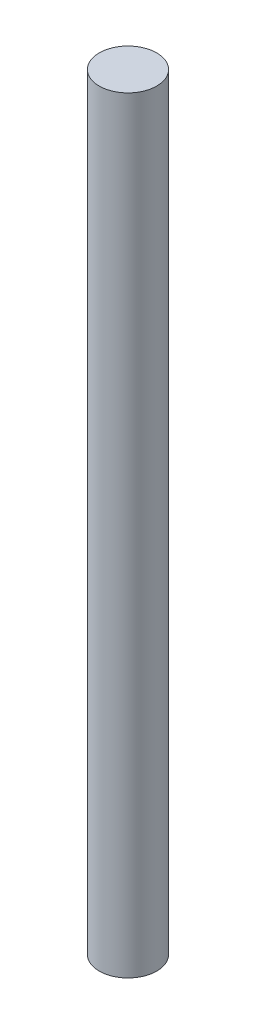
ISO-10303-21;
HEADER;
FILE_DESCRIPTION(('STEP AP214'),'2;1');
FILE_NAME('part.step','',(''),(''),'','','');
FILE_SCHEMA(('AUTOMOTIVE_DESIGN { 1 0 10303 214 1 1 1 1 }'));
ENDSEC;
DATA;
#1=APPLICATION_CONTEXT('core data for automotive mechanical design processes');
#2=APPLICATION_PROTOCOL_DEFINITION('international standard','automotive_design',2000,#1);
#3=PRODUCT_CONTEXT('',#1,'mechanical');
#4=PRODUCT('Part','Part','',(#3));
#5=PRODUCT_RELATED_PRODUCT_CATEGORY('part','',(#4));
#6=PRODUCT_DEFINITION_FORMATION('','',#4);
#7=PRODUCT_DEFINITION_CONTEXT('part definition',#1,'design');
#8=PRODUCT_DEFINITION('design','',#6,#7);
#9=PRODUCT_DEFINITION_SHAPE('','',#8);
#10=(LENGTH_UNIT() NAMED_UNIT(*) SI_UNIT(.MILLI.,.METRE.));
#11=(NAMED_UNIT(*) PLANE_ANGLE_UNIT() SI_UNIT($,.RADIAN.));
#12=(NAMED_UNIT(*) SI_UNIT($,.STERADIAN.) SOLID_ANGLE_UNIT());
#13=UNCERTAINTY_MEASURE_WITH_UNIT(LENGTH_MEASURE(1.E-05),#10,'distance_accuracy_value','');
#14=(GEOMETRIC_REPRESENTATION_CONTEXT(3) GLOBAL_UNCERTAINTY_ASSIGNED_CONTEXT((#13)) GLOBAL_UNIT_ASSIGNED_CONTEXT((#10,
#11,#12)) REPRESENTATION_CONTEXT('',''));
#15=CARTESIAN_POINT('',(0.,0.,0.));
#16=DIRECTION('',(0.,0.,1.));
#17=DIRECTION('',(1.,0.,0.));
#18=AXIS2_PLACEMENT_3D('',#15,#16,#17);
#19=CARTESIAN_POINT('',(0.,40.,0.));
#20=DIRECTION('',(0.,-1.,0.));
#21=DIRECTION('',(0.,0.,-1.));
#22=AXIS2_PLACEMENT_3D('',#19,#20,#21);
#23=CYLINDRICAL_SURFACE('',#22,1.5);
#24=CARTESIAN_POINT('',(0.,40.,0.));
#25=DIRECTION('',(0.,1.,0.));
#26=DIRECTION('',(0.,0.,1.));
#27=AXIS2_PLACEMENT_3D('',#24,#25,#26);
#28=CIRCLE('',#27,1.5);
#29=CARTESIAN_POINT('',(0.,40.,1.5));
#30=VERTEX_POINT('',#29);
#31=EDGE_CURVE('E10',#30,#30,#28,.T.);
#32=ORIENTED_EDGE('',*,*,#31,.F.);
#33=EDGE_LOOP('',(#32));
#34=FACE_BOUND('',#33,.T.);
#35=CARTESIAN_POINT('',(0.,0.,0.));
#36=DIRECTION('',(0.,1.,0.));
#37=DIRECTION('',(0.,0.,1.));
#38=AXIS2_PLACEMENT_3D('',#35,#36,#37);
#39=CIRCLE('',#38,1.5);
#40=CARTESIAN_POINT('',(0.,0.,1.5));
#41=VERTEX_POINT('',#40);
#42=EDGE_CURVE('E31',#41,#41,#39,.T.);
#43=ORIENTED_EDGE('',*,*,#42,.T.);
#44=EDGE_LOOP('',(#43));
#45=FACE_BOUND('',#44,.T.);
#46=ADVANCED_FACE('F28',(#34,#45),#23,.T.);
#47=CARTESIAN_POINT('',(0.,40.,0.));
#48=DIRECTION('',(0.,1.,0.));
#49=DIRECTION('',(0.,0.,1.));
#50=AXIS2_PLACEMENT_3D('',#47,#48,#49);
#51=PLANE('',#50);
#52=ORIENTED_EDGE('',*,*,#31,.T.);
#53=EDGE_LOOP('',(#52));
#54=FACE_BOUND('',#53,.T.);
#55=ADVANCED_FACE('F43',(#54),#51,.T.);
#56=CARTESIAN_POINT('',(0.,0.,0.));
#57=DIRECTION('',(0.,1.,0.));
#58=DIRECTION('',(0.,0.,1.));
#59=AXIS2_PLACEMENT_3D('',#56,#57,#58);
#60=PLANE('',#59);
#61=ORIENTED_EDGE('',*,*,#42,.F.);
#62=EDGE_LOOP('',(#61));
#63=FACE_BOUND('',#62,.T.);
#64=ADVANCED_FACE('F41',(#63),#60,.F.);
#65=CLOSED_SHELL('',(#46,#55,#64));
#66=MANIFOLD_SOLID_BREP('B2',#65);
#67=ADVANCED_BREP_SHAPE_REPRESENTATION('',(#18,#66),#14);
#68=SHAPE_DEFINITION_REPRESENTATION(#9,#67);
ENDSEC;
END-ISO-10303-21;
